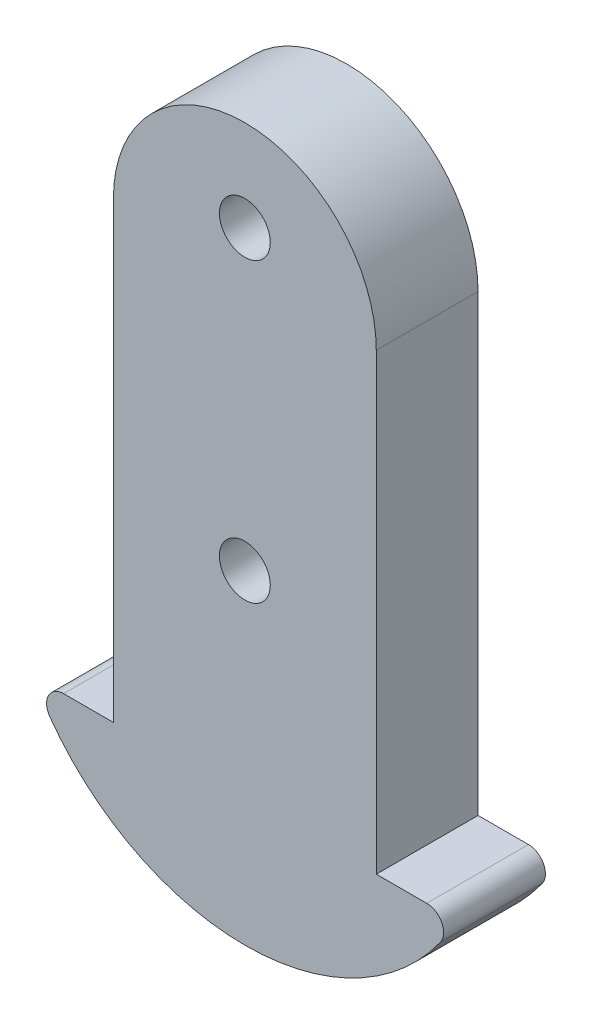
ISO-10303-21;
HEADER;
FILE_DESCRIPTION(('STEP AP214'),'2;1');
FILE_NAME('part.step','',(''),(''),'','','');
FILE_SCHEMA(('AUTOMOTIVE_DESIGN { 1 0 10303 214 1 1 1 1 }'));
ENDSEC;
DATA;
#1=APPLICATION_CONTEXT('core data for automotive mechanical design processes');
#2=APPLICATION_PROTOCOL_DEFINITION('international standard','automotive_design',2000,#1);
#3=PRODUCT_CONTEXT('',#1,'mechanical');
#4=PRODUCT('Part','Part','',(#3));
#5=PRODUCT_RELATED_PRODUCT_CATEGORY('part','',(#4));
#6=PRODUCT_DEFINITION_FORMATION('','',#4);
#7=PRODUCT_DEFINITION_CONTEXT('part definition',#1,'design');
#8=PRODUCT_DEFINITION('design','',#6,#7);
#9=PRODUCT_DEFINITION_SHAPE('','',#8);
#10=(LENGTH_UNIT() NAMED_UNIT(*) SI_UNIT(.MILLI.,.METRE.));
#11=(NAMED_UNIT(*) PLANE_ANGLE_UNIT() SI_UNIT($,.RADIAN.));
#12=(NAMED_UNIT(*) SI_UNIT($,.STERADIAN.) SOLID_ANGLE_UNIT());
#13=UNCERTAINTY_MEASURE_WITH_UNIT(LENGTH_MEASURE(1.E-05),#10,'distance_accuracy_value','');
#14=(GEOMETRIC_REPRESENTATION_CONTEXT(3) GLOBAL_UNCERTAINTY_ASSIGNED_CONTEXT((#13)) GLOBAL_UNIT_ASSIGNED_CONTEXT((#10,
#11,#12)) REPRESENTATION_CONTEXT('',''));
#15=CARTESIAN_POINT('',(0.,0.,0.));
#16=DIRECTION('',(0.,0.,1.));
#17=DIRECTION('',(1.,0.,0.));
#18=AXIS2_PLACEMENT_3D('',#15,#16,#17);
#19=CARTESIAN_POINT('',(7.73385523631223,0.,6.));
#20=DIRECTION('',(1.,0.,0.));
#21=DIRECTION('',(0.,1.,0.));
#22=AXIS2_PLACEMENT_3D('',#19,#20,#21);
#23=PLANE('',#22);
#24=DIRECTION('',(0.,-1.,0.));
#25=VECTOR('',#24,1.);
#26=CARTESIAN_POINT('',(7.73385523631223,0.,0.));
#27=LINE('',#26,#25);
#28=CARTESIAN_POINT('',(7.73385523631223,8.75001681637091,0.));
#29=VERTEX_POINT('',#28);
#30=CARTESIAN_POINT('',(7.73385523631223,-18.,0.));
#31=VERTEX_POINT('',#30);
#32=EDGE_CURVE('E137',#29,#31,#27,.T.);
#33=ORIENTED_EDGE('',*,*,#32,.F.);
#34=DIRECTION('',(0.,0.,-1.));
#35=VECTOR('',#34,1.);
#36=CARTESIAN_POINT('',(7.73385523631223,8.75001681637091,6.));
#37=LINE('',#36,#35);
#38=CARTESIAN_POINT('',(7.73385523631223,8.75001681637091,6.));
#39=VERTEX_POINT('',#38);
#40=EDGE_CURVE('E11',#39,#29,#37,.T.);
#41=ORIENTED_EDGE('',*,*,#40,.F.);
#42=DIRECTION('',(0.,-1.,0.));
#43=VECTOR('',#42,1.);
#44=CARTESIAN_POINT('',(7.73385523631223,0.,6.));
#45=LINE('',#44,#43);
#46=CARTESIAN_POINT('',(7.73385523631223,-18.,6.));
#47=VERTEX_POINT('',#46);
#48=EDGE_CURVE('E228',#39,#47,#45,.T.);
#49=ORIENTED_EDGE('',*,*,#48,.T.);
#50=DIRECTION('',(0.,0.,-1.));
#51=VECTOR('',#50,1.);
#52=CARTESIAN_POINT('',(7.73385523631223,-18.,6.));
#53=LINE('',#52,#51);
#54=EDGE_CURVE('E52',#47,#31,#53,.T.);
#55=ORIENTED_EDGE('',*,*,#54,.T.);
#56=EDGE_LOOP('',(#33,#41,#49,#55));
#57=FACE_BOUND('',#56,.T.);
#58=ADVANCED_FACE('F35',(#57),#23,.T.);
#59=CARTESIAN_POINT('',(-0.016144763687772,8.75001681637091,6.));
#60=DIRECTION('',(0.,0.,-1.));
#61=DIRECTION('',(-1.,0.,0.));
#62=AXIS2_PLACEMENT_3D('',#59,#60,#61);
#63=CYLINDRICAL_SURFACE('',#62,7.75);
#64=CARTESIAN_POINT('',(-0.016144763687772,8.75001681637091,0.));
#65=DIRECTION('',(0.,0.,1.));
#66=DIRECTION('',(1.,0.,0.));
#67=AXIS2_PLACEMENT_3D('',#64,#65,#66);
#68=CIRCLE('',#67,7.75);
#69=CARTESIAN_POINT('',(-7.76614476368777,8.75001681637091,0.));
#70=VERTEX_POINT('',#69);
#71=EDGE_CURVE('E139',#29,#70,#68,.T.);
#72=ORIENTED_EDGE('',*,*,#71,.T.);
#73=DIRECTION('',(0.,0.,-1.));
#74=VECTOR('',#73,1.);
#75=CARTESIAN_POINT('',(-7.76614476368777,8.75001681637091,6.));
#76=LINE('',#75,#74);
#77=CARTESIAN_POINT('',(-7.76614476368777,8.75001681637091,6.));
#78=VERTEX_POINT('',#77);
#79=EDGE_CURVE('E44',#78,#70,#76,.T.);
#80=ORIENTED_EDGE('',*,*,#79,.F.);
#81=CARTESIAN_POINT('',(-0.016144763687772,8.75001681637091,6.));
#82=DIRECTION('',(0.,0.,1.));
#83=DIRECTION('',(1.,0.,0.));
#84=AXIS2_PLACEMENT_3D('',#81,#82,#83);
#85=CIRCLE('',#84,7.75);
#86=EDGE_CURVE('E224',#39,#78,#85,.T.);
#87=ORIENTED_EDGE('',*,*,#86,.F.);
#88=ORIENTED_EDGE('',*,*,#40,.T.);
#89=EDGE_LOOP('',(#72,#80,#87,#88));
#90=FACE_BOUND('',#89,.T.);
#91=ADVANCED_FACE('F170',(#90),#63,.T.);
#92=CARTESIAN_POINT('',(-7.76614476368777,0.,6.));
#93=DIRECTION('',(1.,0.,0.));
#94=DIRECTION('',(0.,1.,0.));
#95=AXIS2_PLACEMENT_3D('',#92,#93,#94);
#96=PLANE('',#95);
#97=DIRECTION('',(0.,-1.,0.));
#98=VECTOR('',#97,1.);
#99=CARTESIAN_POINT('',(-7.76614476368777,0.,0.));
#100=LINE('',#99,#98);
#101=CARTESIAN_POINT('',(-7.76614476368777,-18.,0.));
#102=VERTEX_POINT('',#101);
#103=EDGE_CURVE('E142',#70,#102,#100,.T.);
#104=ORIENTED_EDGE('',*,*,#103,.T.);
#105=DIRECTION('',(0.,0.,-1.));
#106=VECTOR('',#105,1.);
#107=CARTESIAN_POINT('',(-7.76614476368777,-18.,6.));
#108=LINE('',#107,#106);
#109=CARTESIAN_POINT('',(-7.76614476368777,-18.,6.));
#110=VERTEX_POINT('',#109);
#111=EDGE_CURVE('E160',#110,#102,#108,.T.);
#112=ORIENTED_EDGE('',*,*,#111,.F.);
#113=DIRECTION('',(0.,-1.,0.));
#114=VECTOR('',#113,1.);
#115=CARTESIAN_POINT('',(-7.76614476368777,0.,6.));
#116=LINE('',#115,#114);
#117=EDGE_CURVE('E166',#78,#110,#116,.T.);
#118=ORIENTED_EDGE('',*,*,#117,.F.);
#119=ORIENTED_EDGE('',*,*,#79,.T.);
#120=EDGE_LOOP('',(#104,#112,#118,#119));
#121=FACE_BOUND('',#120,.T.);
#122=ADVANCED_FACE('F164',(#121),#96,.F.);
#123=CARTESIAN_POINT('',(0.,-18.,6.));
#124=DIRECTION('',(0.,1.,0.));
#125=DIRECTION('',(0.,0.,1.));
#126=AXIS2_PLACEMENT_3D('',#123,#124,#125);
#127=PLANE('',#126);
#128=DIRECTION('',(1.,0.,0.));
#129=VECTOR('',#128,1.);
#130=CARTESIAN_POINT('',(0.,-18.,0.));
#131=LINE('',#130,#129);
#132=CARTESIAN_POINT('',(-10.7043604822209,-18.,0.));
#133=VERTEX_POINT('',#132);
#134=EDGE_CURVE('E145',#133,#102,#131,.T.);
#135=ORIENTED_EDGE('',*,*,#134,.F.);
#136=DIRECTION('',(0.,0.,-1.));
#137=VECTOR('',#136,1.);
#138=CARTESIAN_POINT('',(-10.7043604822209,-18.,6.));
#139=LINE('',#138,#137);
#140=CARTESIAN_POINT('',(-10.7043604822209,-18.,6.));
#141=VERTEX_POINT('',#140);
#142=EDGE_CURVE('E158',#141,#133,#139,.T.);
#143=ORIENTED_EDGE('',*,*,#142,.F.);
#144=DIRECTION('',(1.,0.,0.));
#145=VECTOR('',#144,1.);
#146=CARTESIAN_POINT('',(0.,-18.,6.));
#147=LINE('',#146,#145);
#148=EDGE_CURVE('E128',#141,#110,#147,.T.);
#149=ORIENTED_EDGE('',*,*,#148,.T.);
#150=ORIENTED_EDGE('',*,*,#111,.T.);
#151=EDGE_LOOP('',(#135,#143,#149,#150));
#152=FACE_BOUND('',#151,.T.);
#153=ADVANCED_FACE('F207',(#152),#127,.T.);
#154=CARTESIAN_POINT('',(-10.7043604822209,-19.,6.));
#155=DIRECTION('',(0.,0.,-1.));
#156=DIRECTION('',(-1.,0.,0.));
#157=AXIS2_PLACEMENT_3D('',#154,#155,#156);
#158=CYLINDRICAL_SURFACE('',#157,1.00000000000003);
#159=CARTESIAN_POINT('',(-10.7043604822209,-19.,0.));
#160=DIRECTION('',(0.,0.,1.));
#161=DIRECTION('',(1.,0.,0.));
#162=AXIS2_PLACEMENT_3D('',#159,#160,#161);
#163=CIRCLE('',#162,1.00000000000003);
#164=CARTESIAN_POINT('',(-11.517349885934,-19.5822784810127,0.));
#165=VERTEX_POINT('',#164);
#166=EDGE_CURVE('E148',#133,#165,#163,.T.);
#167=ORIENTED_EDGE('',*,*,#166,.T.);
#168=DIRECTION('',(0.,0.,-1.));
#169=VECTOR('',#168,1.);
#170=CARTESIAN_POINT('',(-11.517349885934,-19.5822784810127,6.));
#171=LINE('',#170,#169);
#172=CARTESIAN_POINT('',(-11.517349885934,-19.5822784810127,6.));
#173=VERTEX_POINT('',#172);
#174=EDGE_CURVE('E122',#173,#165,#171,.T.);
#175=ORIENTED_EDGE('',*,*,#174,.F.);
#176=CARTESIAN_POINT('',(-10.7043604822209,-19.,6.));
#177=DIRECTION('',(0.,0.,1.));
#178=DIRECTION('',(1.,0.,0.));
#179=AXIS2_PLACEMENT_3D('',#176,#177,#178);
#180=CIRCLE('',#179,1.00000000000003);
#181=EDGE_CURVE('E111',#141,#173,#180,.T.);
#182=ORIENTED_EDGE('',*,*,#181,.F.);
#183=ORIENTED_EDGE('',*,*,#142,.T.);
#184=EDGE_LOOP('',(#167,#175,#182,#183));
#185=FACE_BOUND('',#184,.T.);
#186=ADVANCED_FACE('F211',(#185),#158,.T.);
#187=CARTESIAN_POINT('',(0.,-11.3333333333333,6.));
#188=DIRECTION('',(0.,0.,-1.));
#189=DIRECTION('',(-1.,0.,0.));
#190=AXIS2_PLACEMENT_3D('',#187,#188,#189);
#191=CYLINDRICAL_SURFACE('',#190,14.1666666666667);
#192=CARTESIAN_POINT('',(0.,-11.3333333333333,0.));
#193=DIRECTION('',(0.,0.,1.));
#194=DIRECTION('',(1.,0.,0.));
#195=AXIS2_PLACEMENT_3D('',#192,#193,#194);
#196=CIRCLE('',#195,14.1666666666667);
#197=CARTESIAN_POINT('',(11.517349885934,-19.5822784810127,0.));
#198=VERTEX_POINT('',#197);
#199=EDGE_CURVE('E119',#165,#198,#196,.T.);
#200=ORIENTED_EDGE('',*,*,#199,.T.);
#201=DIRECTION('',(0.,0.,-1.));
#202=VECTOR('',#201,1.);
#203=CARTESIAN_POINT('',(11.517349885934,-19.5822784810127,6.));
#204=LINE('',#203,#202);
#205=CARTESIAN_POINT('',(11.517349885934,-19.5822784810127,6.));
#206=VERTEX_POINT('',#205);
#207=EDGE_CURVE('E117',#206,#198,#204,.T.);
#208=ORIENTED_EDGE('',*,*,#207,.F.);
#209=CARTESIAN_POINT('',(0.,-11.3333333333333,6.));
#210=DIRECTION('',(0.,0.,1.));
#211=DIRECTION('',(1.,0.,0.));
#212=AXIS2_PLACEMENT_3D('',#209,#210,#211);
#213=CIRCLE('',#212,14.1666666666667);
#214=EDGE_CURVE('E102',#173,#206,#213,.T.);
#215=ORIENTED_EDGE('',*,*,#214,.F.);
#216=ORIENTED_EDGE('',*,*,#174,.T.);
#217=EDGE_LOOP('',(#200,#208,#215,#216));
#218=FACE_BOUND('',#217,.T.);
#219=ADVANCED_FACE('F118',(#218),#191,.T.);
#220=CARTESIAN_POINT('',(10.7043604822209,-19.,6.));
#221=DIRECTION('',(0.,0.,-1.));
#222=DIRECTION('',(-1.,0.,0.));
#223=AXIS2_PLACEMENT_3D('',#220,#221,#222);
#224=CYLINDRICAL_SURFACE('',#223,1.00000000000003);
#225=CARTESIAN_POINT('',(10.7043604822209,-19.,0.));
#226=DIRECTION('',(0.,0.,1.));
#227=DIRECTION('',(1.,0.,0.));
#228=AXIS2_PLACEMENT_3D('',#225,#226,#227);
#229=CIRCLE('',#228,1.00000000000003);
#230=CARTESIAN_POINT('',(10.7043604822209,-18.,0.));
#231=VERTEX_POINT('',#230);
#232=EDGE_CURVE('E153',#231,#198,#229,.F.);
#233=ORIENTED_EDGE('',*,*,#232,.F.);
#234=DIRECTION('',(0.,0.,-1.));
#235=VECTOR('',#234,1.);
#236=CARTESIAN_POINT('',(10.7043604822209,-18.,6.));
#237=LINE('',#236,#235);
#238=CARTESIAN_POINT('',(10.7043604822209,-18.,6.));
#239=VERTEX_POINT('',#238);
#240=EDGE_CURVE('E77',#239,#231,#237,.T.);
#241=ORIENTED_EDGE('',*,*,#240,.F.);
#242=CARTESIAN_POINT('',(10.7043604822209,-19.,6.));
#243=DIRECTION('',(0.,0.,1.));
#244=DIRECTION('',(1.,0.,0.));
#245=AXIS2_PLACEMENT_3D('',#242,#243,#244);
#246=CIRCLE('',#245,1.00000000000003);
#247=EDGE_CURVE('E108',#239,#206,#246,.F.);
#248=ORIENTED_EDGE('',*,*,#247,.T.);
#249=ORIENTED_EDGE('',*,*,#207,.T.);
#250=EDGE_LOOP('',(#233,#241,#248,#249));
#251=FACE_BOUND('',#250,.T.);
#252=ADVANCED_FACE('F124',(#251),#224,.T.);
#253=CARTESIAN_POINT('',(-0.0161447636877701,-6.37499999999536,6.));
#254=DIRECTION('',(0.,0.,-1.));
#255=DIRECTION('',(-1.,0.,0.));
#256=AXIS2_PLACEMENT_3D('',#253,#254,#255);
#257=CYLINDRICAL_SURFACE('',#256,1.5);
#258=CARTESIAN_POINT('',(-0.0161447636877701,-6.37499999999536,6.));
#259=DIRECTION('',(0.,0.,1.));
#260=DIRECTION('',(1.,0.,0.));
#261=AXIS2_PLACEMENT_3D('',#258,#259,#260);
#262=CIRCLE('',#261,1.5);
#263=CARTESIAN_POINT('',(1.48385523631223,-6.37499999999536,6.));
#264=VERTEX_POINT('',#263);
#265=EDGE_CURVE('E194',#264,#264,#262,.T.);
#266=ORIENTED_EDGE('',*,*,#265,.T.);
#267=EDGE_LOOP('',(#266));
#268=FACE_BOUND('',#267,.T.);
#269=CARTESIAN_POINT('',(-0.0161447636877701,-6.37499999999536,0.));
#270=DIRECTION('',(0.,0.,1.));
#271=DIRECTION('',(1.,0.,0.));
#272=AXIS2_PLACEMENT_3D('',#269,#270,#271);
#273=CIRCLE('',#272,1.5);
#274=CARTESIAN_POINT('',(1.48385523631223,-6.37499999999536,0.));
#275=VERTEX_POINT('',#274);
#276=EDGE_CURVE('E134',#275,#275,#273,.T.);
#277=ORIENTED_EDGE('',*,*,#276,.F.);
#278=EDGE_LOOP('',(#277));
#279=FACE_BOUND('',#278,.T.);
#280=ADVANCED_FACE('F181',(#268,#279),#257,.F.);
#281=CARTESIAN_POINT('',(-0.0161447636877723,11.1250000000046,6.));
#282=DIRECTION('',(0.,0.,-1.));
#283=DIRECTION('',(-1.,0.,0.));
#284=AXIS2_PLACEMENT_3D('',#281,#282,#283);
#285=CYLINDRICAL_SURFACE('',#284,1.5);
#286=CARTESIAN_POINT('',(-0.0161447636877723,11.1250000000046,6.));
#287=DIRECTION('',(0.,0.,1.));
#288=DIRECTION('',(1.,0.,0.));
#289=AXIS2_PLACEMENT_3D('',#286,#287,#288);
#290=CIRCLE('',#289,1.5);
#291=CARTESIAN_POINT('',(1.48385523631223,11.1250000000046,6.));
#292=VERTEX_POINT('',#291);
#293=EDGE_CURVE('E231',#292,#292,#290,.T.);
#294=ORIENTED_EDGE('',*,*,#293,.T.);
#295=EDGE_LOOP('',(#294));
#296=FACE_BOUND('',#295,.T.);
#297=CARTESIAN_POINT('',(-0.0161447636877723,11.1250000000046,0.));
#298=DIRECTION('',(0.,0.,1.));
#299=DIRECTION('',(1.,0.,0.));
#300=AXIS2_PLACEMENT_3D('',#297,#298,#299);
#301=CIRCLE('',#300,1.5);
#302=CARTESIAN_POINT('',(1.48385523631223,11.1250000000046,0.));
#303=VERTEX_POINT('',#302);
#304=EDGE_CURVE('E131',#303,#303,#301,.T.);
#305=ORIENTED_EDGE('',*,*,#304,.F.);
#306=EDGE_LOOP('',(#305));
#307=FACE_BOUND('',#306,.T.);
#308=ADVANCED_FACE('F37',(#296,#307),#285,.F.);
#309=EDGE_CURVE('E149',#31,#231,#131,.T.);
#310=ORIENTED_EDGE('',*,*,#309,.F.);
#311=ORIENTED_EDGE('',*,*,#54,.F.);
#312=EDGE_CURVE('E125',#47,#239,#147,.T.);
#313=ORIENTED_EDGE('',*,*,#312,.T.);
#314=ORIENTED_EDGE('',*,*,#240,.T.);
#315=EDGE_LOOP('',(#310,#311,#313,#314));
#316=FACE_BOUND('',#315,.T.);
#317=ADVANCED_FACE('F188',(#316),#127,.T.);
#318=CARTESIAN_POINT('',(0.,0.,6.));
#319=DIRECTION('',(0.,0.,1.));
#320=DIRECTION('',(1.,0.,0.));
#321=AXIS2_PLACEMENT_3D('',#318,#319,#320);
#322=PLANE('',#321);
#323=ORIENTED_EDGE('',*,*,#293,.F.);
#324=EDGE_LOOP('',(#323));
#325=FACE_BOUND('',#324,.T.);
#326=ORIENTED_EDGE('',*,*,#265,.F.);
#327=EDGE_LOOP('',(#326));
#328=FACE_BOUND('',#327,.T.);
#329=ORIENTED_EDGE('',*,*,#48,.F.);
#330=ORIENTED_EDGE('',*,*,#86,.T.);
#331=ORIENTED_EDGE('',*,*,#117,.T.);
#332=ORIENTED_EDGE('',*,*,#148,.F.);
#333=ORIENTED_EDGE('',*,*,#181,.T.);
#334=ORIENTED_EDGE('',*,*,#214,.T.);
#335=ORIENTED_EDGE('',*,*,#247,.F.);
#336=ORIENTED_EDGE('',*,*,#312,.F.);
#337=EDGE_LOOP('',(#329,#330,#331,#332,#333,#334,#335,#336));
#338=FACE_BOUND('',#337,.T.);
#339=ADVANCED_FACE('F105',(#325,#328,#338),#322,.T.);
#340=CARTESIAN_POINT('',(0.,0.,0.));
#341=DIRECTION('',(0.,0.,1.));
#342=DIRECTION('',(1.,0.,0.));
#343=AXIS2_PLACEMENT_3D('',#340,#341,#342);
#344=PLANE('',#343);
#345=ORIENTED_EDGE('',*,*,#304,.T.);
#346=EDGE_LOOP('',(#345));
#347=FACE_BOUND('',#346,.T.);
#348=ORIENTED_EDGE('',*,*,#276,.T.);
#349=EDGE_LOOP('',(#348));
#350=FACE_BOUND('',#349,.T.);
#351=ORIENTED_EDGE('',*,*,#32,.T.);
#352=ORIENTED_EDGE('',*,*,#309,.T.);
#353=ORIENTED_EDGE('',*,*,#232,.T.);
#354=ORIENTED_EDGE('',*,*,#199,.F.);
#355=ORIENTED_EDGE('',*,*,#166,.F.);
#356=ORIENTED_EDGE('',*,*,#134,.T.);
#357=ORIENTED_EDGE('',*,*,#103,.F.);
#358=ORIENTED_EDGE('',*,*,#71,.F.);
#359=EDGE_LOOP('',(#351,#352,#353,#354,#355,#356,#357,#358));
#360=FACE_BOUND('',#359,.T.);
#361=ADVANCED_FACE('F172',(#347,#350,#360),#344,.F.);
#362=CLOSED_SHELL('',(#58,#91,#122,#153,#186,#219,#252,#280,#308,#317,#339,#361));
#363=MANIFOLD_SOLID_BREP('B2',#362);
#364=ADVANCED_BREP_SHAPE_REPRESENTATION('',(#18,#363),#14);
#365=SHAPE_DEFINITION_REPRESENTATION(#9,#364);
ENDSEC;
END-ISO-10303-21;
